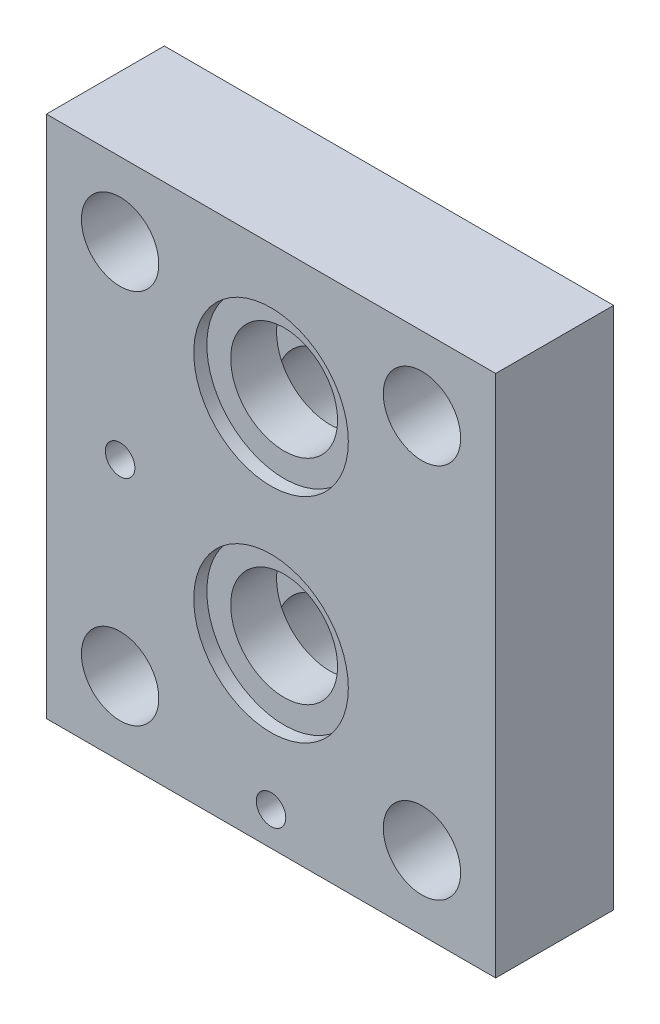
ISO-10303-21;
HEADER;
FILE_DESCRIPTION(('STEP AP214'),'2;1');
FILE_NAME('part.step','',(''),(''),'','','');
FILE_SCHEMA(('AUTOMOTIVE_DESIGN { 1 0 10303 214 1 1 1 1 }'));
ENDSEC;
DATA;
#1=APPLICATION_CONTEXT('core data for automotive mechanical design processes');
#2=APPLICATION_PROTOCOL_DEFINITION('international standard','automotive_design',2000,#1);
#3=PRODUCT_CONTEXT('',#1,'mechanical');
#4=PRODUCT('Part','Part','',(#3));
#5=PRODUCT_RELATED_PRODUCT_CATEGORY('part','',(#4));
#6=PRODUCT_DEFINITION_FORMATION('','',#4);
#7=PRODUCT_DEFINITION_CONTEXT('part definition',#1,'design');
#8=PRODUCT_DEFINITION('design','',#6,#7);
#9=PRODUCT_DEFINITION_SHAPE('','',#8);
#10=(LENGTH_UNIT() NAMED_UNIT(*) SI_UNIT(.MILLI.,.METRE.));
#11=(NAMED_UNIT(*) PLANE_ANGLE_UNIT() SI_UNIT($,.RADIAN.));
#12=(NAMED_UNIT(*) SI_UNIT($,.STERADIAN.) SOLID_ANGLE_UNIT());
#13=UNCERTAINTY_MEASURE_WITH_UNIT(LENGTH_MEASURE(1.E-05),#10,'distance_accuracy_value','');
#14=(GEOMETRIC_REPRESENTATION_CONTEXT(3) GLOBAL_UNCERTAINTY_ASSIGNED_CONTEXT((#13)) GLOBAL_UNIT_ASSIGNED_CONTEXT((#10,
#11,#12)) REPRESENTATION_CONTEXT('',''));
#15=CARTESIAN_POINT('',(0.,0.,0.));
#16=DIRECTION('',(0.,0.,1.));
#17=DIRECTION('',(1.,0.,0.));
#18=AXIS2_PLACEMENT_3D('',#15,#16,#17);
#19=CARTESIAN_POINT('',(0.,27.813,0.));
#20=DIRECTION('',(0.,0.,1.));
#21=DIRECTION('',(1.,0.,0.));
#22=AXIS2_PLACEMENT_3D('',#19,#20,#21);
#23=CYLINDRICAL_SURFACE('',#22,11.509375);
#24=CARTESIAN_POINT('',(0.,27.813,0.));
#25=DIRECTION('',(0.,0.,1.));
#26=DIRECTION('',(1.,0.,0.));
#27=AXIS2_PLACEMENT_3D('',#24,#25,#26);
#28=CIRCLE('',#27,11.509375);
#29=CARTESIAN_POINT('',(-10.4487050341478,22.987,0.));
#30=VERTEX_POINT('',#29);
#31=CARTESIAN_POINT('',(10.4487050341478,22.987,0.));
#32=VERTEX_POINT('',#31);
#33=EDGE_CURVE('E100',#30,#32,#28,.T.);
#34=ORIENTED_EDGE('',*,*,#33,.F.);
#35=EDGE_CURVE('E59',#32,#30,#28,.T.);
#36=ORIENTED_EDGE('',*,*,#35,.F.);
#37=EDGE_LOOP('',(#34,#36));
#38=FACE_BOUND('',#37,.T.);
#39=CARTESIAN_POINT('',(0.,27.813,9.8806));
#40=DIRECTION('',(0.,0.,1.));
#41=DIRECTION('',(1.,0.,0.));
#42=AXIS2_PLACEMENT_3D('',#39,#40,#41);
#43=CIRCLE('',#42,11.509375);
#44=CARTESIAN_POINT('',(11.509375,27.813,9.8806));
#45=VERTEX_POINT('',#44);
#46=EDGE_CURVE('E47',#45,#45,#43,.F.);
#47=ORIENTED_EDGE('',*,*,#46,.F.);
#48=EDGE_LOOP('',(#47));
#49=FACE_BOUND('',#48,.T.);
#50=ADVANCED_FACE('F43',(#38,#49),#23,.F.);
#51=CARTESIAN_POINT('',(0.,-18.161,0.));
#52=DIRECTION('',(0.,0.,1.));
#53=DIRECTION('',(1.,0.,0.));
#54=AXIS2_PLACEMENT_3D('',#51,#52,#53);
#55=CYLINDRICAL_SURFACE('',#54,11.509375);
#56=CARTESIAN_POINT('',(0.,-18.161,0.));
#57=DIRECTION('',(0.,0.,1.));
#58=DIRECTION('',(1.,0.,0.));
#59=AXIS2_PLACEMENT_3D('',#56,#57,#58);
#60=CIRCLE('',#59,11.509375);
#61=CARTESIAN_POINT('',(-10.4487050341478,-22.987,0.));
#62=VERTEX_POINT('',#61);
#63=CARTESIAN_POINT('',(10.4487050341478,-22.987,0.));
#64=VERTEX_POINT('',#63);
#65=EDGE_CURVE('E120',#62,#64,#60,.T.);
#66=ORIENTED_EDGE('',*,*,#65,.F.);
#67=EDGE_CURVE('E66',#64,#62,#60,.T.);
#68=ORIENTED_EDGE('',*,*,#67,.F.);
#69=EDGE_LOOP('',(#66,#68));
#70=FACE_BOUND('',#69,.T.);
#71=CARTESIAN_POINT('',(0.,-18.161,9.8806));
#72=DIRECTION('',(0.,0.,1.));
#73=DIRECTION('',(1.,0.,0.));
#74=AXIS2_PLACEMENT_3D('',#71,#72,#73);
#75=CIRCLE('',#74,11.509375);
#76=CARTESIAN_POINT('',(11.509375,-18.161,9.8806));
#77=VERTEX_POINT('',#76);
#78=EDGE_CURVE('E101',#77,#77,#75,.F.);
#79=ORIENTED_EDGE('',*,*,#78,.F.);
#80=EDGE_LOOP('',(#79));
#81=FACE_BOUND('',#80,.T.);
#82=ADVANCED_FACE('F279',(#70,#81),#55,.F.);
#83=CARTESIAN_POINT('',(48.387,56.388,12.7));
#84=DIRECTION('',(0.,-1.,0.));
#85=DIRECTION('',(0.,0.,-1.));
#86=AXIS2_PLACEMENT_3D('',#83,#84,#85);
#87=PLANE('',#86);
#88=DIRECTION('',(-1.,0.,0.));
#89=VECTOR('',#88,1.);
#90=CARTESIAN_POINT('',(48.387,56.388,-12.7));
#91=LINE('',#90,#89);
#92=CARTESIAN_POINT('',(48.387,56.388,-12.7));
#93=VERTEX_POINT('',#92);
#94=CARTESIAN_POINT('',(-48.387,56.388,-12.7));
#95=VERTEX_POINT('',#94);
#96=EDGE_CURVE('E150',#93,#95,#91,.T.);
#97=ORIENTED_EDGE('',*,*,#96,.T.);
#98=DIRECTION('',(0.,0.,-1.));
#99=VECTOR('',#98,1.);
#100=CARTESIAN_POINT('',(-48.387,56.388,12.7));
#101=LINE('',#100,#99);
#102=CARTESIAN_POINT('',(-48.387,56.388,12.7));
#103=VERTEX_POINT('',#102);
#104=EDGE_CURVE('E11',#103,#95,#101,.T.);
#105=ORIENTED_EDGE('',*,*,#104,.F.);
#106=DIRECTION('',(-1.,0.,0.));
#107=VECTOR('',#106,1.);
#108=CARTESIAN_POINT('',(48.387,56.388,12.7));
#109=LINE('',#108,#107);
#110=CARTESIAN_POINT('',(48.387,56.388,12.7));
#111=VERTEX_POINT('',#110);
#112=EDGE_CURVE('E151',#111,#103,#109,.T.);
#113=ORIENTED_EDGE('',*,*,#112,.F.);
#114=DIRECTION('',(0.,0.,-1.));
#115=VECTOR('',#114,1.);
#116=CARTESIAN_POINT('',(48.387,56.388,12.7));
#117=LINE('',#116,#115);
#118=EDGE_CURVE('E161',#111,#93,#117,.T.);
#119=ORIENTED_EDGE('',*,*,#118,.T.);
#120=EDGE_LOOP('',(#97,#105,#113,#119));
#121=FACE_BOUND('',#120,.T.);
#122=ADVANCED_FACE('F45',(#121),#87,.F.);
#123=CARTESIAN_POINT('',(-48.387,-56.388,12.7));
#124=DIRECTION('',(1.,0.,0.));
#125=DIRECTION('',(0.,0.,-1.));
#126=AXIS2_PLACEMENT_3D('',#123,#124,#125);
#127=PLANE('',#126);
#128=DIRECTION('',(0.,-1.,0.));
#129=VECTOR('',#128,1.);
#130=CARTESIAN_POINT('',(-48.387,-56.388,-12.7));
#131=LINE('',#130,#129);
#132=CARTESIAN_POINT('',(-48.387,-56.388,-12.7));
#133=VERTEX_POINT('',#132);
#134=EDGE_CURVE('E164',#95,#133,#131,.T.);
#135=ORIENTED_EDGE('',*,*,#134,.T.);
#136=DIRECTION('',(0.,0.,-1.));
#137=VECTOR('',#136,1.);
#138=CARTESIAN_POINT('',(-48.387,-56.388,12.7));
#139=LINE('',#138,#137);
#140=CARTESIAN_POINT('',(-48.387,-56.388,12.7));
#141=VERTEX_POINT('',#140);
#142=EDGE_CURVE('E52',#141,#133,#139,.T.);
#143=ORIENTED_EDGE('',*,*,#142,.F.);
#144=DIRECTION('',(0.,-1.,0.));
#145=VECTOR('',#144,1.);
#146=CARTESIAN_POINT('',(-48.387,-56.388,12.7));
#147=LINE('',#146,#145);
#148=EDGE_CURVE('E154',#103,#141,#147,.T.);
#149=ORIENTED_EDGE('',*,*,#148,.F.);
#150=ORIENTED_EDGE('',*,*,#104,.T.);
#151=EDGE_LOOP('',(#135,#143,#149,#150));
#152=FACE_BOUND('',#151,.T.);
#153=ADVANCED_FACE('F255',(#152),#127,.F.);
#154=CARTESIAN_POINT('',(48.387,-56.388,12.7));
#155=DIRECTION('',(0.,1.,0.));
#156=DIRECTION('',(0.,0.,1.));
#157=AXIS2_PLACEMENT_3D('',#154,#155,#156);
#158=PLANE('',#157);
#159=DIRECTION('',(1.,0.,0.));
#160=VECTOR('',#159,1.);
#161=CARTESIAN_POINT('',(48.387,-56.388,-12.7));
#162=LINE('',#161,#160);
#163=CARTESIAN_POINT('',(48.387,-56.388,-12.7));
#164=VERTEX_POINT('',#163);
#165=EDGE_CURVE('E166',#133,#164,#162,.T.);
#166=ORIENTED_EDGE('',*,*,#165,.T.);
#167=DIRECTION('',(0.,0.,-1.));
#168=VECTOR('',#167,1.);
#169=CARTESIAN_POINT('',(48.387,-56.388,12.7));
#170=LINE('',#169,#168);
#171=CARTESIAN_POINT('',(48.387,-56.388,12.7));
#172=VERTEX_POINT('',#171);
#173=EDGE_CURVE('E171',#172,#164,#170,.T.);
#174=ORIENTED_EDGE('',*,*,#173,.F.);
#175=DIRECTION('',(1.,0.,0.));
#176=VECTOR('',#175,1.);
#177=CARTESIAN_POINT('',(48.387,-56.388,12.7));
#178=LINE('',#177,#176);
#179=EDGE_CURVE('E157',#141,#172,#178,.T.);
#180=ORIENTED_EDGE('',*,*,#179,.F.);
#181=ORIENTED_EDGE('',*,*,#142,.T.);
#182=EDGE_LOOP('',(#166,#174,#180,#181));
#183=FACE_BOUND('',#182,.T.);
#184=ADVANCED_FACE('F260',(#183),#158,.F.);
#185=CARTESIAN_POINT('',(48.387,-56.388,12.7));
#186=DIRECTION('',(-1.,0.,0.));
#187=DIRECTION('',(0.,0.,1.));
#188=AXIS2_PLACEMENT_3D('',#185,#186,#187);
#189=PLANE('',#188);
#190=DIRECTION('',(0.,1.,0.));
#191=VECTOR('',#190,1.);
#192=CARTESIAN_POINT('',(48.387,-56.388,-12.7));
#193=LINE('',#192,#191);
#194=EDGE_CURVE('E155',#164,#93,#193,.T.);
#195=ORIENTED_EDGE('',*,*,#194,.T.);
#196=ORIENTED_EDGE('',*,*,#118,.F.);
#197=DIRECTION('',(0.,1.,0.));
#198=VECTOR('',#197,1.);
#199=CARTESIAN_POINT('',(48.387,-56.388,12.7));
#200=LINE('',#199,#198);
#201=EDGE_CURVE('E159',#172,#111,#200,.T.);
#202=ORIENTED_EDGE('',*,*,#201,.F.);
#203=ORIENTED_EDGE('',*,*,#173,.T.);
#204=EDGE_LOOP('',(#195,#196,#202,#203));
#205=FACE_BOUND('',#204,.T.);
#206=ADVANCED_FACE('F231',(#205),#189,.F.);
#207=CARTESIAN_POINT('',(0.,0.,12.7));
#208=DIRECTION('',(0.,0.,-1.));
#209=DIRECTION('',(-1.,0.,0.));
#210=AXIS2_PLACEMENT_3D('',#207,#208,#209);
#211=PLANE('',#210);
#212=CARTESIAN_POINT('',(0.,-49.149,12.7));
#213=DIRECTION('',(0.,0.,1.));
#214=DIRECTION('',(1.,0.,0.));
#215=AXIS2_PLACEMENT_3D('',#212,#213,#214);
#216=CIRCLE('',#215,3.175);
#217=CARTESIAN_POINT('',(3.175,-49.149,12.7));
#218=VERTEX_POINT('',#217);
#219=EDGE_CURVE('E212',#218,#218,#216,.T.);
#220=ORIENTED_EDGE('',*,*,#219,.F.);
#221=EDGE_LOOP('',(#220));
#222=FACE_BOUND('',#221,.T.);
#223=CARTESIAN_POINT('',(-32.512,-0.127000000000009,12.7));
#224=DIRECTION('',(0.,0.,1.));
#225=DIRECTION('',(1.,0.,0.));
#226=AXIS2_PLACEMENT_3D('',#223,#224,#225);
#227=CIRCLE('',#226,3.175);
#228=CARTESIAN_POINT('',(-29.337,-0.127000000000009,12.7));
#229=VERTEX_POINT('',#228);
#230=EDGE_CURVE('E209',#229,#229,#227,.T.);
#231=ORIENTED_EDGE('',*,*,#230,.F.);
#232=EDGE_LOOP('',(#231));
#233=FACE_BOUND('',#232,.T.);
#234=CARTESIAN_POINT('',(0.,27.813,12.7));
#235=DIRECTION('',(0.,0.,1.));
#236=DIRECTION('',(1.,0.,0.));
#237=AXIS2_PLACEMENT_3D('',#234,#235,#236);
#238=CIRCLE('',#237,16.6497);
#239=CARTESIAN_POINT('',(16.6497,27.813,12.7));
#240=VERTEX_POINT('',#239);
#241=EDGE_CURVE('E187',#240,#240,#238,.T.);
#242=ORIENTED_EDGE('',*,*,#241,.F.);
#243=EDGE_LOOP('',(#242));
#244=FACE_BOUND('',#243,.T.);
#245=CARTESIAN_POINT('',(0.,-18.161,12.7));
#246=DIRECTION('',(0.,0.,1.));
#247=DIRECTION('',(1.,0.,0.));
#248=AXIS2_PLACEMENT_3D('',#245,#246,#247);
#249=CIRCLE('',#248,16.6497);
#250=CARTESIAN_POINT('',(16.6497,-18.161,12.7));
#251=VERTEX_POINT('',#250);
#252=EDGE_CURVE('E180',#251,#251,#249,.T.);
#253=ORIENTED_EDGE('',*,*,#252,.F.);
#254=EDGE_LOOP('',(#253));
#255=FACE_BOUND('',#254,.T.);
#256=CARTESIAN_POINT('',(32.512,40.513,12.7));
#257=DIRECTION('',(0.,0.,-1.));
#258=DIRECTION('',(-1.,0.,0.));
#259=AXIS2_PLACEMENT_3D('',#256,#257,#258);
#260=CIRCLE('',#259,8.33437499999998);
#261=CARTESIAN_POINT('',(24.177625,40.513,12.7));
#262=VERTEX_POINT('',#261);
#263=EDGE_CURVE('E129',#262,#262,#260,.T.);
#264=ORIENTED_EDGE('',*,*,#263,.T.);
#265=EDGE_LOOP('',(#264));
#266=FACE_BOUND('',#265,.T.);
#267=CARTESIAN_POINT('',(-32.512,-40.513,12.7));
#268=DIRECTION('',(0.,0.,-1.));
#269=DIRECTION('',(-1.,0.,0.));
#270=AXIS2_PLACEMENT_3D('',#267,#268,#269);
#271=CIRCLE('',#270,8.33437499999998);
#272=CARTESIAN_POINT('',(-40.846375,-40.513,12.7));
#273=VERTEX_POINT('',#272);
#274=EDGE_CURVE('E135',#273,#273,#271,.T.);
#275=ORIENTED_EDGE('',*,*,#274,.T.);
#276=EDGE_LOOP('',(#275));
#277=FACE_BOUND('',#276,.T.);
#278=CARTESIAN_POINT('',(-32.512,40.513,12.7));
#279=DIRECTION('',(0.,0.,-1.));
#280=DIRECTION('',(-1.,0.,0.));
#281=AXIS2_PLACEMENT_3D('',#278,#279,#280);
#282=CIRCLE('',#281,8.33437499999998);
#283=CARTESIAN_POINT('',(-40.846375,40.513,12.7));
#284=VERTEX_POINT('',#283);
#285=EDGE_CURVE('E141',#284,#284,#282,.T.);
#286=ORIENTED_EDGE('',*,*,#285,.T.);
#287=EDGE_LOOP('',(#286));
#288=FACE_BOUND('',#287,.T.);
#289=CARTESIAN_POINT('',(32.512,-40.513,12.7));
#290=DIRECTION('',(0.,0.,-1.));
#291=DIRECTION('',(-1.,0.,0.));
#292=AXIS2_PLACEMENT_3D('',#289,#290,#291);
#293=CIRCLE('',#292,8.33437499999998);
#294=CARTESIAN_POINT('',(24.177625,-40.513,12.7));
#295=VERTEX_POINT('',#294);
#296=EDGE_CURVE('E147',#295,#295,#293,.T.);
#297=ORIENTED_EDGE('',*,*,#296,.T.);
#298=EDGE_LOOP('',(#297));
#299=FACE_BOUND('',#298,.T.);
#300=ORIENTED_EDGE('',*,*,#112,.T.);
#301=ORIENTED_EDGE('',*,*,#148,.T.);
#302=ORIENTED_EDGE('',*,*,#179,.T.);
#303=ORIENTED_EDGE('',*,*,#201,.T.);
#304=EDGE_LOOP('',(#300,#301,#302,#303));
#305=FACE_BOUND('',#304,.T.);
#306=ADVANCED_FACE('F227',(#222,#233,#244,#255,#266,#277,#288,#299,#305),#211,.F.);
#307=CARTESIAN_POINT('',(0.,0.,-12.7));
#308=DIRECTION('',(0.,0.,-1.));
#309=DIRECTION('',(-1.,0.,0.));
#310=AXIS2_PLACEMENT_3D('',#307,#308,#309);
#311=PLANE('',#310);
#312=CARTESIAN_POINT('',(0.,49.149,-12.7));
#313=DIRECTION('',(0.,0.,1.));
#314=DIRECTION('',(1.,0.,0.));
#315=AXIS2_PLACEMENT_3D('',#312,#313,#314);
#316=CIRCLE('',#315,3.571875);
#317=CARTESIAN_POINT('',(3.571875,49.149,-12.7));
#318=VERTEX_POINT('',#317);
#319=EDGE_CURVE('E201',#318,#318,#316,.T.);
#320=ORIENTED_EDGE('',*,*,#319,.T.);
#321=EDGE_LOOP('',(#320));
#322=FACE_BOUND('',#321,.T.);
#323=CARTESIAN_POINT('',(32.512,0.126999999999986,-12.7));
#324=DIRECTION('',(0.,0.,1.));
#325=DIRECTION('',(1.,0.,0.));
#326=AXIS2_PLACEMENT_3D('',#323,#324,#325);
#327=CIRCLE('',#326,3.571875);
#328=CARTESIAN_POINT('',(36.083875,0.126999999999986,-12.7));
#329=VERTEX_POINT('',#328);
#330=EDGE_CURVE('E197',#329,#329,#327,.T.);
#331=ORIENTED_EDGE('',*,*,#330,.T.);
#332=EDGE_LOOP('',(#331));
#333=FACE_BOUND('',#332,.T.);
#334=CARTESIAN_POINT('',(0.,18.161,-12.7));
#335=DIRECTION('',(0.,0.,1.));
#336=DIRECTION('',(1.,0.,0.));
#337=AXIS2_PLACEMENT_3D('',#334,#335,#336);
#338=CIRCLE('',#337,11.509375);
#339=CARTESIAN_POINT('',(11.509375,18.161,-12.7));
#340=VERTEX_POINT('',#339);
#341=EDGE_CURVE('E110',#340,#340,#338,.T.);
#342=ORIENTED_EDGE('',*,*,#341,.T.);
#343=EDGE_LOOP('',(#342));
#344=FACE_BOUND('',#343,.T.);
#345=CARTESIAN_POINT('',(0.,-27.813,-12.7));
#346=DIRECTION('',(0.,0.,1.));
#347=DIRECTION('',(1.,0.,0.));
#348=AXIS2_PLACEMENT_3D('',#345,#346,#347);
#349=CIRCLE('',#348,11.509375);
#350=CARTESIAN_POINT('',(11.509375,-27.813,-12.7));
#351=VERTEX_POINT('',#350);
#352=EDGE_CURVE('E114',#351,#351,#349,.T.);
#353=ORIENTED_EDGE('',*,*,#352,.T.);
#354=EDGE_LOOP('',(#353));
#355=FACE_BOUND('',#354,.T.);
#356=CARTESIAN_POINT('',(32.512,40.513,-12.7));
#357=DIRECTION('',(0.,0.,-1.));
#358=DIRECTION('',(-1.,0.,0.));
#359=AXIS2_PLACEMENT_3D('',#356,#357,#358);
#360=CIRCLE('',#359,8.33437499999999);
#361=CARTESIAN_POINT('',(24.177625,40.513,-12.7));
#362=VERTEX_POINT('',#361);
#363=EDGE_CURVE('E125',#362,#362,#360,.T.);
#364=ORIENTED_EDGE('',*,*,#363,.F.);
#365=EDGE_LOOP('',(#364));
#366=FACE_BOUND('',#365,.T.);
#367=CARTESIAN_POINT('',(-32.512,-40.513,-12.7));
#368=DIRECTION('',(0.,0.,-1.));
#369=DIRECTION('',(-1.,0.,0.));
#370=AXIS2_PLACEMENT_3D('',#367,#368,#369);
#371=CIRCLE('',#370,8.33437499999999);
#372=CARTESIAN_POINT('',(-40.846375,-40.513,-12.7));
#373=VERTEX_POINT('',#372);
#374=EDGE_CURVE('E132',#373,#373,#371,.T.);
#375=ORIENTED_EDGE('',*,*,#374,.F.);
#376=EDGE_LOOP('',(#375));
#377=FACE_BOUND('',#376,.T.);
#378=CARTESIAN_POINT('',(-32.512,40.513,-12.7));
#379=DIRECTION('',(0.,0.,-1.));
#380=DIRECTION('',(-1.,0.,0.));
#381=AXIS2_PLACEMENT_3D('',#378,#379,#380);
#382=CIRCLE('',#381,8.33437499999999);
#383=CARTESIAN_POINT('',(-40.846375,40.513,-12.7));
#384=VERTEX_POINT('',#383);
#385=EDGE_CURVE('E138',#384,#384,#382,.T.);
#386=ORIENTED_EDGE('',*,*,#385,.F.);
#387=EDGE_LOOP('',(#386));
#388=FACE_BOUND('',#387,.T.);
#389=CARTESIAN_POINT('',(32.512,-40.513,-12.7));
#390=DIRECTION('',(0.,0.,-1.));
#391=DIRECTION('',(-1.,0.,0.));
#392=AXIS2_PLACEMENT_3D('',#389,#390,#391);
#393=CIRCLE('',#392,8.33437499999999);
#394=CARTESIAN_POINT('',(24.177625,-40.513,-12.7));
#395=VERTEX_POINT('',#394);
#396=EDGE_CURVE('E144',#395,#395,#393,.T.);
#397=ORIENTED_EDGE('',*,*,#396,.F.);
#398=EDGE_LOOP('',(#397));
#399=FACE_BOUND('',#398,.T.);
#400=ORIENTED_EDGE('',*,*,#96,.F.);
#401=ORIENTED_EDGE('',*,*,#194,.F.);
#402=ORIENTED_EDGE('',*,*,#165,.F.);
#403=ORIENTED_EDGE('',*,*,#134,.F.);
#404=EDGE_LOOP('',(#400,#401,#402,#403));
#405=FACE_BOUND('',#404,.T.);
#406=ADVANCED_FACE('F230',(#322,#333,#344,#355,#366,#377,#388,#399,#405),#311,.T.);
#407=CARTESIAN_POINT('',(32.512,-40.513,-12.7));
#408=DIRECTION('',(0.,0.,-1.));
#409=DIRECTION('',(-1.,0.,0.));
#410=AXIS2_PLACEMENT_3D('',#407,#408,#409);
#411=CYLINDRICAL_SURFACE('',#410,8.33437499999999);
#412=ORIENTED_EDGE('',*,*,#296,.F.);
#413=EDGE_LOOP('',(#412));
#414=FACE_BOUND('',#413,.T.);
#415=ORIENTED_EDGE('',*,*,#396,.T.);
#416=EDGE_LOOP('',(#415));
#417=FACE_BOUND('',#416,.T.);
#418=ADVANCED_FACE('F265',(#414,#417),#411,.F.);
#419=CARTESIAN_POINT('',(-32.512,40.513,-12.7));
#420=DIRECTION('',(0.,0.,-1.));
#421=DIRECTION('',(-1.,0.,0.));
#422=AXIS2_PLACEMENT_3D('',#419,#420,#421);
#423=CYLINDRICAL_SURFACE('',#422,8.33437499999999);
#424=ORIENTED_EDGE('',*,*,#285,.F.);
#425=EDGE_LOOP('',(#424));
#426=FACE_BOUND('',#425,.T.);
#427=ORIENTED_EDGE('',*,*,#385,.T.);
#428=EDGE_LOOP('',(#427));
#429=FACE_BOUND('',#428,.T.);
#430=ADVANCED_FACE('F273',(#426,#429),#423,.F.);
#431=CARTESIAN_POINT('',(-32.512,-40.513,-12.7));
#432=DIRECTION('',(0.,0.,-1.));
#433=DIRECTION('',(-1.,0.,0.));
#434=AXIS2_PLACEMENT_3D('',#431,#432,#433);
#435=CYLINDRICAL_SURFACE('',#434,8.33437499999999);
#436=ORIENTED_EDGE('',*,*,#274,.F.);
#437=EDGE_LOOP('',(#436));
#438=FACE_BOUND('',#437,.T.);
#439=ORIENTED_EDGE('',*,*,#374,.T.);
#440=EDGE_LOOP('',(#439));
#441=FACE_BOUND('',#440,.T.);
#442=ADVANCED_FACE('F309',(#438,#441),#435,.F.);
#443=CARTESIAN_POINT('',(32.512,40.513,-12.7));
#444=DIRECTION('',(0.,0.,-1.));
#445=DIRECTION('',(-1.,0.,0.));
#446=AXIS2_PLACEMENT_3D('',#443,#444,#445);
#447=CYLINDRICAL_SURFACE('',#446,8.33437499999999);
#448=ORIENTED_EDGE('',*,*,#263,.F.);
#449=EDGE_LOOP('',(#448));
#450=FACE_BOUND('',#449,.T.);
#451=ORIENTED_EDGE('',*,*,#363,.T.);
#452=EDGE_LOOP('',(#451));
#453=FACE_BOUND('',#452,.T.);
#454=ADVANCED_FACE('F305',(#450,#453),#447,.F.);
#455=CARTESIAN_POINT('',(0.,-27.813,0.));
#456=DIRECTION('',(0.,0.,-1.));
#457=DIRECTION('',(-1.,0.,0.));
#458=AXIS2_PLACEMENT_3D('',#455,#456,#457);
#459=CYLINDRICAL_SURFACE('',#458,11.509375);
#460=CARTESIAN_POINT('',(0.,-27.813,0.));
#461=DIRECTION('',(0.,0.,1.));
#462=DIRECTION('',(1.,0.,0.));
#463=AXIS2_PLACEMENT_3D('',#460,#461,#462);
#464=CIRCLE('',#463,11.509375);
#465=EDGE_CURVE('E123',#64,#62,#464,.T.);
#466=ORIENTED_EDGE('',*,*,#465,.T.);
#467=EDGE_CURVE('E116',#62,#64,#464,.T.);
#468=ORIENTED_EDGE('',*,*,#467,.T.);
#469=EDGE_LOOP('',(#466,#468));
#470=FACE_BOUND('',#469,.T.);
#471=ORIENTED_EDGE('',*,*,#352,.F.);
#472=EDGE_LOOP('',(#471));
#473=FACE_BOUND('',#472,.T.);
#474=ADVANCED_FACE('F301',(#470,#473),#459,.F.);
#475=CARTESIAN_POINT('',(0.,-27.813,0.));
#476=DIRECTION('',(0.,0.,1.));
#477=DIRECTION('',(1.,0.,0.));
#478=AXIS2_PLACEMENT_3D('',#475,#476,#477);
#479=PLANE('',#478);
#480=ORIENTED_EDGE('',*,*,#467,.F.);
#481=ORIENTED_EDGE('',*,*,#65,.T.);
#482=EDGE_LOOP('',(#480,#481));
#483=FACE_BOUND('',#482,.T.);
#484=ADVANCED_FACE('F298',(#483),#479,.F.);
#485=CARTESIAN_POINT('',(0.,18.161,0.));
#486=DIRECTION('',(0.,0.,-1.));
#487=DIRECTION('',(-1.,0.,0.));
#488=AXIS2_PLACEMENT_3D('',#485,#486,#487);
#489=CYLINDRICAL_SURFACE('',#488,11.509375);
#490=CARTESIAN_POINT('',(0.,18.161,0.));
#491=DIRECTION('',(0.,0.,1.));
#492=DIRECTION('',(1.,0.,0.));
#493=AXIS2_PLACEMENT_3D('',#490,#491,#492);
#494=CIRCLE('',#493,11.509375);
#495=EDGE_CURVE('E98',#32,#30,#494,.T.);
#496=ORIENTED_EDGE('',*,*,#495,.T.);
#497=EDGE_CURVE('E107',#30,#32,#494,.T.);
#498=ORIENTED_EDGE('',*,*,#497,.T.);
#499=EDGE_LOOP('',(#496,#498));
#500=FACE_BOUND('',#499,.T.);
#501=ORIENTED_EDGE('',*,*,#341,.F.);
#502=EDGE_LOOP('',(#501));
#503=FACE_BOUND('',#502,.T.);
#504=ADVANCED_FACE('F112',(#500,#503),#489,.F.);
#505=CARTESIAN_POINT('',(0.,18.161,0.));
#506=DIRECTION('',(0.,0.,1.));
#507=DIRECTION('',(1.,0.,0.));
#508=AXIS2_PLACEMENT_3D('',#505,#506,#507);
#509=PLANE('',#508);
#510=ORIENTED_EDGE('',*,*,#497,.F.);
#511=ORIENTED_EDGE('',*,*,#33,.T.);
#512=EDGE_LOOP('',(#510,#511));
#513=FACE_BOUND('',#512,.T.);
#514=ADVANCED_FACE('F108',(#513),#509,.F.);
#515=CARTESIAN_POINT('',(0.,-18.161,0.));
#516=DIRECTION('',(0.,0.,1.));
#517=DIRECTION('',(1.,0.,0.));
#518=AXIS2_PLACEMENT_3D('',#515,#516,#517);
#519=PLANE('',#518);
#520=ORIENTED_EDGE('',*,*,#67,.T.);
#521=ORIENTED_EDGE('',*,*,#465,.F.);
#522=EDGE_LOOP('',(#520,#521));
#523=FACE_BOUND('',#522,.T.);
#524=ADVANCED_FACE('F290',(#523),#519,.T.);
#525=CARTESIAN_POINT('',(0.,27.813,0.));
#526=DIRECTION('',(0.,0.,1.));
#527=DIRECTION('',(1.,0.,0.));
#528=AXIS2_PLACEMENT_3D('',#525,#526,#527);
#529=PLANE('',#528);
#530=ORIENTED_EDGE('',*,*,#35,.T.);
#531=ORIENTED_EDGE('',*,*,#495,.F.);
#532=EDGE_LOOP('',(#530,#531));
#533=FACE_BOUND('',#532,.T.);
#534=ADVANCED_FACE('F96',(#533),#529,.T.);
#535=CARTESIAN_POINT('',(0.,-18.161,9.8806));
#536=DIRECTION('',(0.,0.,1.));
#537=DIRECTION('',(1.,0.,0.));
#538=AXIS2_PLACEMENT_3D('',#535,#536,#537);
#539=PLANE('',#538);
#540=CARTESIAN_POINT('',(0.,-18.161,9.8806));
#541=DIRECTION('',(0.,0.,1.));
#542=DIRECTION('',(1.,0.,0.));
#543=AXIS2_PLACEMENT_3D('',#540,#541,#542);
#544=CIRCLE('',#543,16.6497);
#545=CARTESIAN_POINT('',(16.6497,-18.161,9.8806));
#546=VERTEX_POINT('',#545);
#547=EDGE_CURVE('E176',#546,#546,#544,.T.);
#548=ORIENTED_EDGE('',*,*,#547,.T.);
#549=EDGE_LOOP('',(#548));
#550=FACE_BOUND('',#549,.T.);
#551=ORIENTED_EDGE('',*,*,#78,.T.);
#552=EDGE_LOOP('',(#551));
#553=FACE_BOUND('',#552,.T.);
#554=ADVANCED_FACE('F368',(#550,#553),#539,.T.);
#555=CARTESIAN_POINT('',(0.,-18.161,9.8806));
#556=DIRECTION('',(0.,0.,1.));
#557=DIRECTION('',(1.,0.,0.));
#558=AXIS2_PLACEMENT_3D('',#555,#556,#557);
#559=CYLINDRICAL_SURFACE('',#558,16.6497);
#560=ORIENTED_EDGE('',*,*,#547,.F.);
#561=EDGE_LOOP('',(#560));
#562=FACE_BOUND('',#561,.T.);
#563=ORIENTED_EDGE('',*,*,#252,.T.);
#564=EDGE_LOOP('',(#563));
#565=FACE_BOUND('',#564,.T.);
#566=ADVANCED_FACE('F380',(#562,#565),#559,.F.);
#567=CARTESIAN_POINT('',(0.,27.813,9.8806));
#568=DIRECTION('',(0.,0.,1.));
#569=DIRECTION('',(1.,0.,0.));
#570=AXIS2_PLACEMENT_3D('',#567,#568,#569);
#571=PLANE('',#570);
#572=CARTESIAN_POINT('',(0.,27.813,9.8806));
#573=DIRECTION('',(0.,0.,1.));
#574=DIRECTION('',(1.,0.,0.));
#575=AXIS2_PLACEMENT_3D('',#572,#573,#574);
#576=CIRCLE('',#575,16.6497);
#577=CARTESIAN_POINT('',(16.6497,27.813,9.8806));
#578=VERTEX_POINT('',#577);
#579=EDGE_CURVE('E190',#578,#578,#576,.T.);
#580=ORIENTED_EDGE('',*,*,#579,.T.);
#581=EDGE_LOOP('',(#580));
#582=FACE_BOUND('',#581,.T.);
#583=ORIENTED_EDGE('',*,*,#46,.T.);
#584=EDGE_LOOP('',(#583));
#585=FACE_BOUND('',#584,.T.);
#586=ADVANCED_FACE('F386',(#582,#585),#571,.T.);
#587=CARTESIAN_POINT('',(0.,27.813,9.8806));
#588=DIRECTION('',(0.,0.,1.));
#589=DIRECTION('',(1.,0.,0.));
#590=AXIS2_PLACEMENT_3D('',#587,#588,#589);
#591=CYLINDRICAL_SURFACE('',#590,16.6497);
#592=ORIENTED_EDGE('',*,*,#579,.F.);
#593=EDGE_LOOP('',(#592));
#594=FACE_BOUND('',#593,.T.);
#595=ORIENTED_EDGE('',*,*,#241,.T.);
#596=EDGE_LOOP('',(#595));
#597=FACE_BOUND('',#596,.T.);
#598=ADVANCED_FACE('F401',(#594,#597),#591,.F.);
#599=CARTESIAN_POINT('',(32.512,0.126999999999986,-4.826));
#600=DIRECTION('',(0.,0.,-1.));
#601=DIRECTION('',(-1.,0.,0.));
#602=AXIS2_PLACEMENT_3D('',#599,#600,#601);
#603=CYLINDRICAL_SURFACE('',#602,3.571875);
#604=CARTESIAN_POINT('',(32.512,0.126999999999986,-4.826));
#605=DIRECTION('',(0.,0.,1.));
#606=DIRECTION('',(1.,0.,0.));
#607=AXIS2_PLACEMENT_3D('',#604,#605,#606);
#608=CIRCLE('',#607,3.571875);
#609=CARTESIAN_POINT('',(36.083875,0.126999999999986,-4.826));
#610=VERTEX_POINT('',#609);
#611=EDGE_CURVE('E194',#610,#610,#608,.T.);
#612=ORIENTED_EDGE('',*,*,#611,.T.);
#613=EDGE_LOOP('',(#612));
#614=FACE_BOUND('',#613,.T.);
#615=ORIENTED_EDGE('',*,*,#330,.F.);
#616=EDGE_LOOP('',(#615));
#617=FACE_BOUND('',#616,.T.);
#618=ADVANCED_FACE('F410',(#614,#617),#603,.F.);
#619=CARTESIAN_POINT('',(32.512,0.126999999999986,-4.826));
#620=DIRECTION('',(0.,0.,1.));
#621=DIRECTION('',(1.,0.,0.));
#622=AXIS2_PLACEMENT_3D('',#619,#620,#621);
#623=PLANE('',#622);
#624=ORIENTED_EDGE('',*,*,#611,.F.);
#625=EDGE_LOOP('',(#624));
#626=FACE_BOUND('',#625,.T.);
#627=ADVANCED_FACE('F419',(#626),#623,.F.);
#628=CARTESIAN_POINT('',(0.,49.149,-4.826));
#629=DIRECTION('',(0.,0.,-1.));
#630=DIRECTION('',(-1.,0.,0.));
#631=AXIS2_PLACEMENT_3D('',#628,#629,#630);
#632=CYLINDRICAL_SURFACE('',#631,3.571875);
#633=CARTESIAN_POINT('',(0.,49.149,-4.826));
#634=DIRECTION('',(0.,0.,1.));
#635=DIRECTION('',(1.,0.,0.));
#636=AXIS2_PLACEMENT_3D('',#633,#634,#635);
#637=CIRCLE('',#636,3.571875);
#638=CARTESIAN_POINT('',(3.571875,49.149,-4.826));
#639=VERTEX_POINT('',#638);
#640=EDGE_CURVE('E191',#639,#639,#637,.T.);
#641=ORIENTED_EDGE('',*,*,#640,.T.);
#642=EDGE_LOOP('',(#641));
#643=FACE_BOUND('',#642,.T.);
#644=ORIENTED_EDGE('',*,*,#319,.F.);
#645=EDGE_LOOP('',(#644));
#646=FACE_BOUND('',#645,.T.);
#647=ADVANCED_FACE('F429',(#643,#646),#632,.F.);
#648=CARTESIAN_POINT('',(0.,49.149,-4.826));
#649=DIRECTION('',(0.,0.,1.));
#650=DIRECTION('',(1.,0.,0.));
#651=AXIS2_PLACEMENT_3D('',#648,#649,#650);
#652=PLANE('',#651);
#653=ORIENTED_EDGE('',*,*,#640,.F.);
#654=EDGE_LOOP('',(#653));
#655=FACE_BOUND('',#654,.T.);
#656=ADVANCED_FACE('F439',(#655),#652,.F.);
#657=CARTESIAN_POINT('',(-32.512,-0.127000000000009,4.826));
#658=DIRECTION('',(0.,0.,1.));
#659=DIRECTION('',(1.,0.,0.));
#660=AXIS2_PLACEMENT_3D('',#657,#658,#659);
#661=CYLINDRICAL_SURFACE('',#660,3.175);
#662=CARTESIAN_POINT('',(-32.512,-0.127000000000009,4.826));
#663=DIRECTION('',(0.,0.,1.));
#664=DIRECTION('',(1.,0.,0.));
#665=AXIS2_PLACEMENT_3D('',#662,#663,#664);
#666=CIRCLE('',#665,3.175);
#667=CARTESIAN_POINT('',(-29.337,-0.127000000000009,4.826));
#668=VERTEX_POINT('',#667);
#669=EDGE_CURVE('E206',#668,#668,#666,.T.);
#670=ORIENTED_EDGE('',*,*,#669,.F.);
#671=EDGE_LOOP('',(#670));
#672=FACE_BOUND('',#671,.T.);
#673=ORIENTED_EDGE('',*,*,#230,.T.);
#674=EDGE_LOOP('',(#673));
#675=FACE_BOUND('',#674,.T.);
#676=ADVANCED_FACE('F449',(#672,#675),#661,.F.);
#677=CARTESIAN_POINT('',(-32.512,-0.127000000000009,4.826));
#678=DIRECTION('',(0.,0.,1.));
#679=DIRECTION('',(1.,0.,0.));
#680=AXIS2_PLACEMENT_3D('',#677,#678,#679);
#681=PLANE('',#680);
#682=ORIENTED_EDGE('',*,*,#669,.T.);
#683=EDGE_LOOP('',(#682));
#684=FACE_BOUND('',#683,.T.);
#685=ADVANCED_FACE('F223',(#684),#681,.T.);
#686=CARTESIAN_POINT('',(0.,-49.149,4.826));
#687=DIRECTION('',(0.,0.,1.));
#688=DIRECTION('',(1.,0.,0.));
#689=AXIS2_PLACEMENT_3D('',#686,#687,#688);
#690=CYLINDRICAL_SURFACE('',#689,3.175);
#691=CARTESIAN_POINT('',(0.,-49.149,4.826));
#692=DIRECTION('',(0.,0.,1.));
#693=DIRECTION('',(1.,0.,0.));
#694=AXIS2_PLACEMENT_3D('',#691,#692,#693);
#695=CIRCLE('',#694,3.175);
#696=CARTESIAN_POINT('',(3.175,-49.149,4.826));
#697=VERTEX_POINT('',#696);
#698=EDGE_CURVE('E198',#697,#697,#695,.T.);
#699=ORIENTED_EDGE('',*,*,#698,.F.);
#700=EDGE_LOOP('',(#699));
#701=FACE_BOUND('',#700,.T.);
#702=ORIENTED_EDGE('',*,*,#219,.T.);
#703=EDGE_LOOP('',(#702));
#704=FACE_BOUND('',#703,.T.);
#705=ADVANCED_FACE('F220',(#701,#704),#690,.F.);
#706=CARTESIAN_POINT('',(0.,-49.149,4.826));
#707=DIRECTION('',(0.,0.,1.));
#708=DIRECTION('',(1.,0.,0.));
#709=AXIS2_PLACEMENT_3D('',#706,#707,#708);
#710=PLANE('',#709);
#711=ORIENTED_EDGE('',*,*,#698,.T.);
#712=EDGE_LOOP('',(#711));
#713=FACE_BOUND('',#712,.T.);
#714=ADVANCED_FACE('F218',(#713),#710,.T.);
#715=CLOSED_SHELL('',(#50,#82,#122,#153,#184,#206,#306,#406,#418,#430,#442,#454,#474,#484,#504,
#514,#524,#534,#554,#566,#586,#598,#618,#627,#647,#656,#676,#685,#705,#714));
#716=MANIFOLD_SOLID_BREP('B2',#715);
#717=ADVANCED_BREP_SHAPE_REPRESENTATION('',(#18,#716),#14);
#718=SHAPE_DEFINITION_REPRESENTATION(#9,#717);
ENDSEC;
END-ISO-10303-21;
